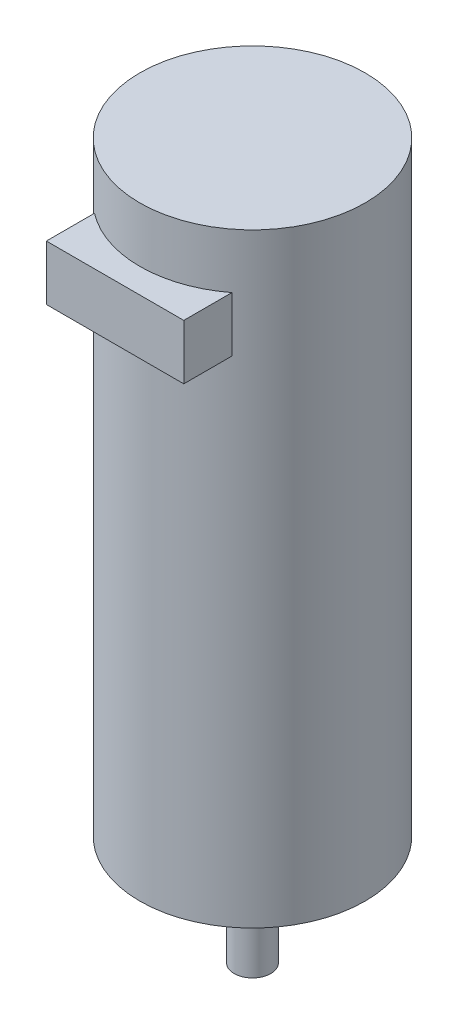
ISO-10303-21;
HEADER;
FILE_DESCRIPTION(('STEP AP214'),'2;1');
FILE_NAME('part.step','',(''),(''),'','','');
FILE_SCHEMA(('AUTOMOTIVE_DESIGN { 1 0 10303 214 1 1 1 1 }'));
ENDSEC;
DATA;
#1=APPLICATION_CONTEXT('core data for automotive mechanical design processes');
#2=APPLICATION_PROTOCOL_DEFINITION('international standard','automotive_design',2000,#1);
#3=PRODUCT_CONTEXT('',#1,'mechanical');
#4=PRODUCT('Part','Part','',(#3));
#5=PRODUCT_RELATED_PRODUCT_CATEGORY('part','',(#4));
#6=PRODUCT_DEFINITION_FORMATION('','',#4);
#7=PRODUCT_DEFINITION_CONTEXT('part definition',#1,'design');
#8=PRODUCT_DEFINITION('design','',#6,#7);
#9=PRODUCT_DEFINITION_SHAPE('','',#8);
#10=(LENGTH_UNIT() NAMED_UNIT(*) SI_UNIT(.MILLI.,.METRE.));
#11=(NAMED_UNIT(*) PLANE_ANGLE_UNIT() SI_UNIT($,.RADIAN.));
#12=(NAMED_UNIT(*) SI_UNIT($,.STERADIAN.) SOLID_ANGLE_UNIT());
#13=UNCERTAINTY_MEASURE_WITH_UNIT(LENGTH_MEASURE(1.E-05),#10,'distance_accuracy_value','');
#14=(GEOMETRIC_REPRESENTATION_CONTEXT(3) GLOBAL_UNCERTAINTY_ASSIGNED_CONTEXT((#13)) GLOBAL_UNIT_ASSIGNED_CONTEXT((#10,
#11,#12)) REPRESENTATION_CONTEXT('',''));
#15=CARTESIAN_POINT('',(0.,0.,0.));
#16=DIRECTION('',(0.,0.,1.));
#17=DIRECTION('',(1.,0.,0.));
#18=AXIS2_PLACEMENT_3D('',#15,#16,#17);
#19=CARTESIAN_POINT('',(0.,66.,0.));
#20=DIRECTION('',(0.,-1.,0.));
#21=DIRECTION('',(0.,0.,-1.));
#22=AXIS2_PLACEMENT_3D('',#19,#20,#21);
#23=CYLINDRICAL_SURFACE('',#22,12.3);
#24=CARTESIAN_POINT('',(0.,0.,0.));
#25=DIRECTION('',(0.,1.,0.));
#26=DIRECTION('',(0.,0.,1.));
#27=AXIS2_PLACEMENT_3D('',#24,#25,#26);
#28=CIRCLE('',#27,12.3);
#29=CARTESIAN_POINT('',(0.,0.,12.3));
#30=VERTEX_POINT('',#29);
#31=EDGE_CURVE('E97',#30,#30,#28,.T.);
#32=ORIENTED_EDGE('',*,*,#31,.T.);
#33=EDGE_LOOP('',(#32));
#34=FACE_BOUND('',#33,.T.);
#35=CARTESIAN_POINT('',(0.,66.,0.));
#36=DIRECTION('',(0.,1.,0.));
#37=DIRECTION('',(0.,0.,1.));
#38=AXIS2_PLACEMENT_3D('',#35,#36,#37);
#39=CIRCLE('',#38,12.3);
#40=CARTESIAN_POINT('',(0.,66.,12.3));
#41=VERTEX_POINT('',#40);
#42=EDGE_CURVE('E100',#41,#41,#39,.T.);
#43=ORIENTED_EDGE('',*,*,#42,.F.);
#44=EDGE_LOOP('',(#43));
#45=FACE_BOUND('',#44,.T.);
#46=DIRECTION('',(0.,-1.,0.));
#47=VECTOR('',#46,1.);
#48=CARTESIAN_POINT('',(-7.5,66.,9.74884608556315));
#49=LINE('',#48,#47);
#50=CARTESIAN_POINT('',(-7.5,60.,9.74884608556315));
#51=VERTEX_POINT('',#50);
#52=CARTESIAN_POINT('',(-7.5,54.,9.74884608556315));
#53=VERTEX_POINT('',#52);
#54=EDGE_CURVE('E38',#51,#53,#49,.T.);
#55=ORIENTED_EDGE('',*,*,#54,.F.);
#56=CARTESIAN_POINT('',(0.,60.,0.));
#57=DIRECTION('',(0.,-1.,0.));
#58=DIRECTION('',(0.,0.,-1.));
#59=AXIS2_PLACEMENT_3D('',#56,#57,#58);
#60=CIRCLE('',#59,12.3);
#61=CARTESIAN_POINT('',(7.5,60.,9.74884608556316));
#62=VERTEX_POINT('',#61);
#63=EDGE_CURVE('E107',#62,#51,#60,.T.);
#64=ORIENTED_EDGE('',*,*,#63,.F.);
#65=DIRECTION('',(0.,-1.,0.));
#66=VECTOR('',#65,1.);
#67=CARTESIAN_POINT('',(7.5,66.,9.74884608556316));
#68=LINE('',#67,#66);
#69=CARTESIAN_POINT('',(7.5,54.,9.74884608556316));
#70=VERTEX_POINT('',#69);
#71=EDGE_CURVE('E56',#70,#62,#68,.F.);
#72=ORIENTED_EDGE('',*,*,#71,.F.);
#73=CARTESIAN_POINT('',(0.,54.,0.));
#74=DIRECTION('',(0.,1.,0.));
#75=DIRECTION('',(0.,0.,1.));
#76=AXIS2_PLACEMENT_3D('',#73,#74,#75);
#77=CIRCLE('',#76,12.3);
#78=EDGE_CURVE('E51',#53,#70,#77,.T.);
#79=ORIENTED_EDGE('',*,*,#78,.F.);
#80=EDGE_LOOP('',(#55,#64,#72,#79));
#81=FACE_BOUND('',#80,.T.);
#82=ADVANCED_FACE('F35',(#34,#45,#81),#23,.T.);
#83=CARTESIAN_POINT('',(0.,66.,0.));
#84=DIRECTION('',(0.,1.,0.));
#85=DIRECTION('',(0.,0.,1.));
#86=AXIS2_PLACEMENT_3D('',#83,#84,#85);
#87=PLANE('',#86);
#88=ORIENTED_EDGE('',*,*,#42,.T.);
#89=EDGE_LOOP('',(#88));
#90=FACE_BOUND('',#89,.T.);
#91=ADVANCED_FACE('F137',(#90),#87,.T.);
#92=CARTESIAN_POINT('',(0.,0.,0.));
#93=DIRECTION('',(0.,1.,0.));
#94=DIRECTION('',(0.,0.,1.));
#95=AXIS2_PLACEMENT_3D('',#92,#93,#94);
#96=PLANE('',#95);
#97=CARTESIAN_POINT('',(0.,0.,8.5));
#98=DIRECTION('',(0.,-1.,0.));
#99=DIRECTION('',(0.,0.,-1.));
#100=AXIS2_PLACEMENT_3D('',#97,#98,#99);
#101=CIRCLE('',#100,1.6);
#102=CARTESIAN_POINT('',(0.,0.,6.9));
#103=VERTEX_POINT('',#102);
#104=EDGE_CURVE('E155',#103,#103,#101,.T.);
#105=ORIENTED_EDGE('',*,*,#104,.F.);
#106=EDGE_LOOP('',(#105));
#107=FACE_BOUND('',#106,.T.);
#108=CARTESIAN_POINT('',(0.,0.,-8.5));
#109=DIRECTION('',(0.,-1.,0.));
#110=DIRECTION('',(0.,0.,-1.));
#111=AXIS2_PLACEMENT_3D('',#108,#109,#110);
#112=CIRCLE('',#111,1.6);
#113=CARTESIAN_POINT('',(0.,0.,-10.1));
#114=VERTEX_POINT('',#113);
#115=EDGE_CURVE('E159',#114,#114,#112,.T.);
#116=ORIENTED_EDGE('',*,*,#115,.F.);
#117=EDGE_LOOP('',(#116));
#118=FACE_BOUND('',#117,.T.);
#119=CARTESIAN_POINT('',(0.,0.,0.));
#120=DIRECTION('',(0.,-1.,0.));
#121=DIRECTION('',(0.,0.,-1.));
#122=AXIS2_PLACEMENT_3D('',#119,#120,#121);
#123=CIRCLE('',#122,3.5);
#124=CARTESIAN_POINT('',(0.,0.,-3.5));
#125=VERTEX_POINT('',#124);
#126=EDGE_CURVE('E43',#125,#125,#123,.T.);
#127=ORIENTED_EDGE('',*,*,#126,.F.);
#128=EDGE_LOOP('',(#127));
#129=FACE_BOUND('',#128,.T.);
#130=ORIENTED_EDGE('',*,*,#31,.F.);
#131=EDGE_LOOP('',(#130));
#132=FACE_BOUND('',#131,.T.);
#133=ADVANCED_FACE('F133',(#107,#118,#129,#132),#96,.F.);
#134=CARTESIAN_POINT('',(-7.5,60.,15.));
#135=DIRECTION('',(1.,0.,0.));
#136=DIRECTION('',(0.,1.,0.));
#137=AXIS2_PLACEMENT_3D('',#134,#135,#136);
#138=PLANE('',#137);
#139=DIRECTION('',(0.,0.,-1.));
#140=VECTOR('',#139,1.);
#141=CARTESIAN_POINT('',(-7.5,60.,15.));
#142=LINE('',#141,#140);
#143=CARTESIAN_POINT('',(-7.5,60.,15.));
#144=VERTEX_POINT('',#143);
#145=EDGE_CURVE('E119',#144,#51,#142,.T.);
#146=ORIENTED_EDGE('',*,*,#145,.T.);
#147=ORIENTED_EDGE('',*,*,#54,.T.);
#148=DIRECTION('',(0.,0.,-1.));
#149=VECTOR('',#148,1.);
#150=CARTESIAN_POINT('',(-7.5,54.,15.));
#151=LINE('',#150,#149);
#152=CARTESIAN_POINT('',(-7.5,54.,15.));
#153=VERTEX_POINT('',#152);
#154=EDGE_CURVE('E79',#153,#53,#151,.T.);
#155=ORIENTED_EDGE('',*,*,#154,.F.);
#156=DIRECTION('',(0.,-1.,0.));
#157=VECTOR('',#156,1.);
#158=CARTESIAN_POINT('',(-7.5,60.,15.));
#159=LINE('',#158,#157);
#160=EDGE_CURVE('E85',#144,#153,#159,.T.);
#161=ORIENTED_EDGE('',*,*,#160,.F.);
#162=EDGE_LOOP('',(#146,#147,#155,#161));
#163=FACE_BOUND('',#162,.T.);
#164=ADVANCED_FACE('F96',(#163),#138,.F.);
#165=CARTESIAN_POINT('',(7.5,60.,15.));
#166=DIRECTION('',(-1.,0.,0.));
#167=DIRECTION('',(0.,-1.,0.));
#168=AXIS2_PLACEMENT_3D('',#165,#166,#167);
#169=PLANE('',#168);
#170=DIRECTION('',(0.,0.,-1.));
#171=VECTOR('',#170,1.);
#172=CARTESIAN_POINT('',(7.5,54.,15.));
#173=LINE('',#172,#171);
#174=CARTESIAN_POINT('',(7.5,54.,15.));
#175=VERTEX_POINT('',#174);
#176=EDGE_CURVE('E81',#175,#70,#173,.T.);
#177=ORIENTED_EDGE('',*,*,#176,.T.);
#178=ORIENTED_EDGE('',*,*,#71,.T.);
#179=DIRECTION('',(0.,0.,-1.));
#180=VECTOR('',#179,1.);
#181=CARTESIAN_POINT('',(7.5,60.,15.));
#182=LINE('',#181,#180);
#183=CARTESIAN_POINT('',(7.5,60.,15.));
#184=VERTEX_POINT('',#183);
#185=EDGE_CURVE('E102',#184,#62,#182,.T.);
#186=ORIENTED_EDGE('',*,*,#185,.F.);
#187=DIRECTION('',(0.,1.,0.));
#188=VECTOR('',#187,1.);
#189=CARTESIAN_POINT('',(7.5,60.,15.));
#190=LINE('',#189,#188);
#191=EDGE_CURVE('E84',#175,#184,#190,.T.);
#192=ORIENTED_EDGE('',*,*,#191,.F.);
#193=EDGE_LOOP('',(#177,#178,#186,#192));
#194=FACE_BOUND('',#193,.T.);
#195=ADVANCED_FACE('F125',(#194),#169,.F.);
#196=CARTESIAN_POINT('',(-7.5,54.,15.));
#197=DIRECTION('',(0.,1.,0.));
#198=DIRECTION('',(0.,0.,1.));
#199=AXIS2_PLACEMENT_3D('',#196,#197,#198);
#200=PLANE('',#199);
#201=ORIENTED_EDGE('',*,*,#154,.T.);
#202=ORIENTED_EDGE('',*,*,#78,.T.);
#203=ORIENTED_EDGE('',*,*,#176,.F.);
#204=DIRECTION('',(1.,0.,0.));
#205=VECTOR('',#204,1.);
#206=CARTESIAN_POINT('',(-7.5,54.,15.));
#207=LINE('',#206,#205);
#208=EDGE_CURVE('E75',#153,#175,#207,.T.);
#209=ORIENTED_EDGE('',*,*,#208,.F.);
#210=EDGE_LOOP('',(#201,#202,#203,#209));
#211=FACE_BOUND('',#210,.T.);
#212=ADVANCED_FACE('F77',(#211),#200,.F.);
#213=CARTESIAN_POINT('',(-7.5,60.,15.));
#214=DIRECTION('',(0.,-1.,0.));
#215=DIRECTION('',(0.,0.,-1.));
#216=AXIS2_PLACEMENT_3D('',#213,#214,#215);
#217=PLANE('',#216);
#218=ORIENTED_EDGE('',*,*,#185,.T.);
#219=ORIENTED_EDGE('',*,*,#63,.T.);
#220=ORIENTED_EDGE('',*,*,#145,.F.);
#221=DIRECTION('',(-1.,0.,0.));
#222=VECTOR('',#221,1.);
#223=CARTESIAN_POINT('',(-7.5,60.,15.));
#224=LINE('',#223,#222);
#225=EDGE_CURVE('E90',#184,#144,#224,.T.);
#226=ORIENTED_EDGE('',*,*,#225,.F.);
#227=EDGE_LOOP('',(#218,#219,#220,#226));
#228=FACE_BOUND('',#227,.T.);
#229=ADVANCED_FACE('F123',(#228),#217,.F.);
#230=CARTESIAN_POINT('',(0.,0.,15.));
#231=DIRECTION('',(0.,0.,1.));
#232=DIRECTION('',(1.,0.,0.));
#233=AXIS2_PLACEMENT_3D('',#230,#231,#232);
#234=PLANE('',#233);
#235=ORIENTED_EDGE('',*,*,#160,.T.);
#236=ORIENTED_EDGE('',*,*,#208,.T.);
#237=ORIENTED_EDGE('',*,*,#191,.T.);
#238=ORIENTED_EDGE('',*,*,#225,.T.);
#239=EDGE_LOOP('',(#235,#236,#237,#238));
#240=FACE_BOUND('',#239,.T.);
#241=ADVANCED_FACE('F88',(#240),#234,.T.);
#242=CARTESIAN_POINT('',(0.,-2.5,0.));
#243=DIRECTION('',(0.,1.,0.));
#244=DIRECTION('',(0.,0.,1.));
#245=AXIS2_PLACEMENT_3D('',#242,#243,#244);
#246=CYLINDRICAL_SURFACE('',#245,3.5);
#247=CARTESIAN_POINT('',(0.,-2.5,0.));
#248=DIRECTION('',(0.,-1.,0.));
#249=DIRECTION('',(0.,0.,-1.));
#250=AXIS2_PLACEMENT_3D('',#247,#248,#249);
#251=CIRCLE('',#250,3.5);
#252=CARTESIAN_POINT('',(0.,-2.5,-3.5));
#253=VERTEX_POINT('',#252);
#254=EDGE_CURVE('E94',#253,#253,#251,.T.);
#255=ORIENTED_EDGE('',*,*,#254,.F.);
#256=EDGE_LOOP('',(#255));
#257=FACE_BOUND('',#256,.T.);
#258=ORIENTED_EDGE('',*,*,#126,.T.);
#259=EDGE_LOOP('',(#258));
#260=FACE_BOUND('',#259,.T.);
#261=ADVANCED_FACE('F206',(#257,#260),#246,.T.);
#262=CARTESIAN_POINT('',(0.,-2.5,0.));
#263=DIRECTION('',(0.,-1.,0.));
#264=DIRECTION('',(0.,0.,-1.));
#265=AXIS2_PLACEMENT_3D('',#262,#263,#264);
#266=PLANE('',#265);
#267=CARTESIAN_POINT('',(0.,-2.5,0.));
#268=DIRECTION('',(0.,-1.,0.));
#269=DIRECTION('',(0.,0.,-1.));
#270=AXIS2_PLACEMENT_3D('',#267,#268,#269);
#271=CIRCLE('',#270,2.);
#272=CARTESIAN_POINT('',(0.,-2.5,-2.));
#273=VERTEX_POINT('',#272);
#274=EDGE_CURVE('E11',#273,#273,#271,.T.);
#275=ORIENTED_EDGE('',*,*,#274,.F.);
#276=EDGE_LOOP('',(#275));
#277=FACE_BOUND('',#276,.T.);
#278=ORIENTED_EDGE('',*,*,#254,.T.);
#279=EDGE_LOOP('',(#278));
#280=FACE_BOUND('',#279,.T.);
#281=ADVANCED_FACE('F202',(#277,#280),#266,.T.);
#282=CARTESIAN_POINT('',(0.,-12.,0.));
#283=DIRECTION('',(0.,1.,0.));
#284=DIRECTION('',(0.,0.,1.));
#285=AXIS2_PLACEMENT_3D('',#282,#283,#284);
#286=CYLINDRICAL_SURFACE('',#285,2.);
#287=CARTESIAN_POINT('',(0.,-12.,0.));
#288=DIRECTION('',(0.,-1.,0.));
#289=DIRECTION('',(0.,0.,-1.));
#290=AXIS2_PLACEMENT_3D('',#287,#288,#289);
#291=CIRCLE('',#290,2.);
#292=CARTESIAN_POINT('',(0.,-12.,-2.));
#293=VERTEX_POINT('',#292);
#294=EDGE_CURVE('E167',#293,#293,#291,.T.);
#295=ORIENTED_EDGE('',*,*,#294,.F.);
#296=EDGE_LOOP('',(#295));
#297=FACE_BOUND('',#296,.T.);
#298=ORIENTED_EDGE('',*,*,#274,.T.);
#299=EDGE_LOOP('',(#298));
#300=FACE_BOUND('',#299,.T.);
#301=ADVANCED_FACE('F199',(#297,#300),#286,.T.);
#302=CARTESIAN_POINT('',(0.,-12.,0.));
#303=DIRECTION('',(0.,-1.,0.));
#304=DIRECTION('',(0.,0.,-1.));
#305=AXIS2_PLACEMENT_3D('',#302,#303,#304);
#306=PLANE('',#305);
#307=ORIENTED_EDGE('',*,*,#294,.T.);
#308=EDGE_LOOP('',(#307));
#309=FACE_BOUND('',#308,.T.);
#310=ADVANCED_FACE('F195',(#309),#306,.T.);
#311=CARTESIAN_POINT('',(0.,4.,-8.5));
#312=DIRECTION('',(0.,-1.,0.));
#313=DIRECTION('',(0.,0.,-1.));
#314=AXIS2_PLACEMENT_3D('',#311,#312,#313);
#315=CYLINDRICAL_SURFACE('',#314,1.6);
#316=CARTESIAN_POINT('',(0.,4.,-8.5));
#317=DIRECTION('',(0.,-1.,0.));
#318=DIRECTION('',(0.,0.,-1.));
#319=AXIS2_PLACEMENT_3D('',#316,#317,#318);
#320=CIRCLE('',#319,1.6);
#321=CARTESIAN_POINT('',(0.,4.,-10.1));
#322=VERTEX_POINT('',#321);
#323=EDGE_CURVE('E161',#322,#322,#320,.T.);
#324=ORIENTED_EDGE('',*,*,#323,.F.);
#325=EDGE_LOOP('',(#324));
#326=FACE_BOUND('',#325,.T.);
#327=ORIENTED_EDGE('',*,*,#115,.T.);
#328=EDGE_LOOP('',(#327));
#329=FACE_BOUND('',#328,.T.);
#330=ADVANCED_FACE('F189',(#326,#329),#315,.F.);
#331=CARTESIAN_POINT('',(0.,4.,-8.5));
#332=DIRECTION('',(0.,-1.,0.));
#333=DIRECTION('',(0.,0.,-1.));
#334=AXIS2_PLACEMENT_3D('',#331,#332,#333);
#335=PLANE('',#334);
#336=ORIENTED_EDGE('',*,*,#323,.T.);
#337=EDGE_LOOP('',(#336));
#338=FACE_BOUND('',#337,.T.);
#339=ADVANCED_FACE('F181',(#338),#335,.T.);
#340=CARTESIAN_POINT('',(0.,4.,8.5));
#341=DIRECTION('',(0.,-1.,0.));
#342=DIRECTION('',(0.,0.,-1.));
#343=AXIS2_PLACEMENT_3D('',#340,#341,#342);
#344=CYLINDRICAL_SURFACE('',#343,1.6);
#345=CARTESIAN_POINT('',(0.,4.,8.5));
#346=DIRECTION('',(0.,-1.,0.));
#347=DIRECTION('',(0.,0.,-1.));
#348=AXIS2_PLACEMENT_3D('',#345,#346,#347);
#349=CIRCLE('',#348,1.6);
#350=CARTESIAN_POINT('',(0.,4.,6.9));
#351=VERTEX_POINT('',#350);
#352=EDGE_CURVE('E169',#351,#351,#349,.T.);
#353=ORIENTED_EDGE('',*,*,#352,.F.);
#354=EDGE_LOOP('',(#353));
#355=FACE_BOUND('',#354,.T.);
#356=ORIENTED_EDGE('',*,*,#104,.T.);
#357=EDGE_LOOP('',(#356));
#358=FACE_BOUND('',#357,.T.);
#359=ADVANCED_FACE('F178',(#355,#358),#344,.F.);
#360=CARTESIAN_POINT('',(0.,4.,8.5));
#361=DIRECTION('',(0.,-1.,0.));
#362=DIRECTION('',(0.,0.,-1.));
#363=AXIS2_PLACEMENT_3D('',#360,#361,#362);
#364=PLANE('',#363);
#365=ORIENTED_EDGE('',*,*,#352,.T.);
#366=EDGE_LOOP('',(#365));
#367=FACE_BOUND('',#366,.T.);
#368=ADVANCED_FACE('F180',(#367),#364,.T.);
#369=CLOSED_SHELL('',(#82,#91,#133,#164,#195,#212,#229,#241,#261,#281,#301,#310,#330,#339,#359,#368));
#370=MANIFOLD_SOLID_BREP('B2',#369);
#371=ADVANCED_BREP_SHAPE_REPRESENTATION('',(#18,#370),#14);
#372=SHAPE_DEFINITION_REPRESENTATION(#9,#371);
ENDSEC;
END-ISO-10303-21;
